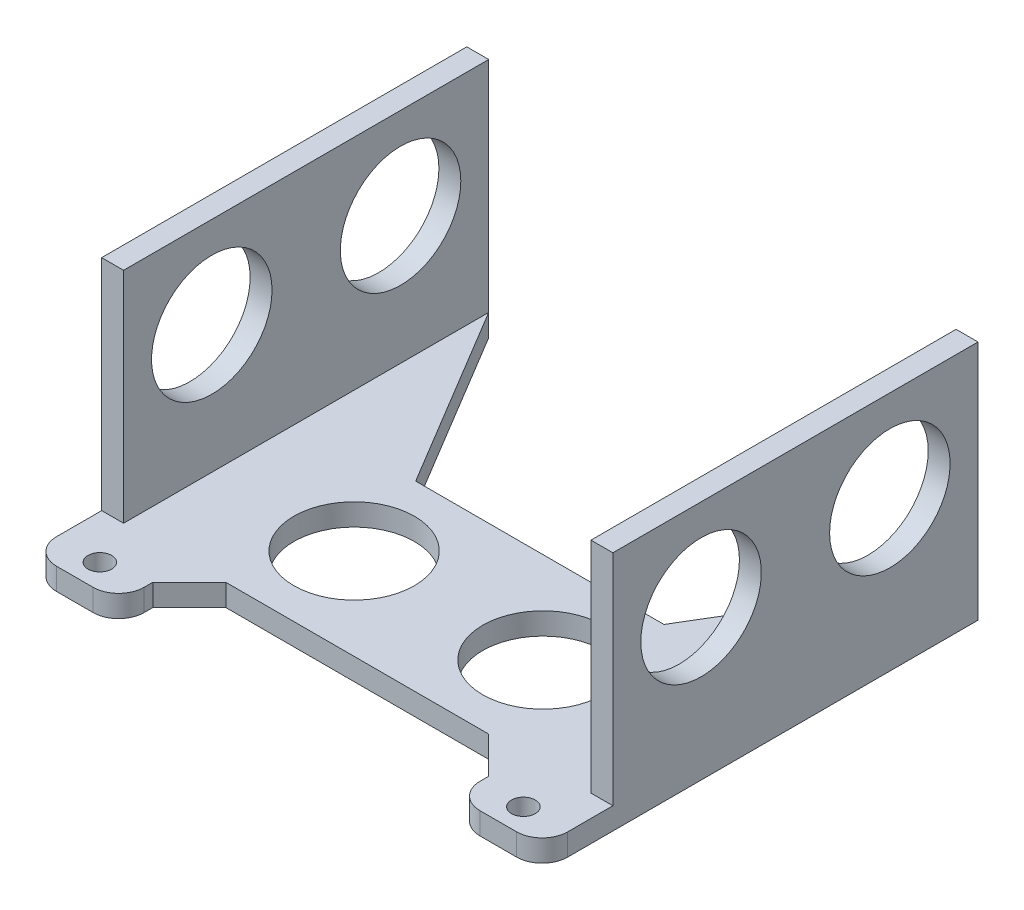
ISO-10303-21;
HEADER;
FILE_DESCRIPTION(('STEP AP214'),'2;1');
FILE_NAME('part.step','',(''),(''),'','','');
FILE_SCHEMA(('AUTOMOTIVE_DESIGN { 1 0 10303 214 1 1 1 1 }'));
ENDSEC;
DATA;
#1=APPLICATION_CONTEXT('core data for automotive mechanical design processes');
#2=APPLICATION_PROTOCOL_DEFINITION('international standard','automotive_design',2000,#1);
#3=PRODUCT_CONTEXT('',#1,'mechanical');
#4=PRODUCT('Part','Part','',(#3));
#5=PRODUCT_RELATED_PRODUCT_CATEGORY('part','',(#4));
#6=PRODUCT_DEFINITION_FORMATION('','',#4);
#7=PRODUCT_DEFINITION_CONTEXT('part definition',#1,'design');
#8=PRODUCT_DEFINITION('design','',#6,#7);
#9=PRODUCT_DEFINITION_SHAPE('','',#8);
#10=(LENGTH_UNIT() NAMED_UNIT(*) SI_UNIT(.MILLI.,.METRE.));
#11=(NAMED_UNIT(*) PLANE_ANGLE_UNIT() SI_UNIT($,.RADIAN.));
#12=(NAMED_UNIT(*) SI_UNIT($,.STERADIAN.) SOLID_ANGLE_UNIT());
#13=UNCERTAINTY_MEASURE_WITH_UNIT(LENGTH_MEASURE(1.E-05),#10,'distance_accuracy_value','');
#14=(GEOMETRIC_REPRESENTATION_CONTEXT(3) GLOBAL_UNCERTAINTY_ASSIGNED_CONTEXT((#13)) GLOBAL_UNIT_ASSIGNED_CONTEXT((#10,
#11,#12)) REPRESENTATION_CONTEXT('',''));
#15=CARTESIAN_POINT('',(0.,0.,0.));
#16=DIRECTION('',(0.,0.,1.));
#17=DIRECTION('',(1.,0.,0.));
#18=AXIS2_PLACEMENT_3D('',#15,#16,#17);
#19=CARTESIAN_POINT('',(0.,3.,0.));
#20=DIRECTION('',(0.,-1.,0.));
#21=DIRECTION('',(0.,0.,-1.));
#22=AXIS2_PLACEMENT_3D('',#19,#20,#21);
#23=PLANE('',#22);
#24=CARTESIAN_POINT('',(29.,3.,25.25));
#25=DIRECTION('',(0.,-1.,0.));
#26=DIRECTION('',(0.,0.,-1.));
#27=AXIS2_PLACEMENT_3D('',#24,#25,#26);
#28=CIRCLE('',#27,1.625);
#29=CARTESIAN_POINT('',(29.,3.,23.625));
#30=VERTEX_POINT('',#29);
#31=EDGE_CURVE('E335',#30,#30,#28,.T.);
#32=ORIENTED_EDGE('',*,*,#31,.T.);
#33=EDGE_LOOP('',(#32));
#34=FACE_BOUND('',#33,.T.);
#35=CARTESIAN_POINT('',(-29.,3.,25.25));
#36=DIRECTION('',(0.,-1.,0.));
#37=DIRECTION('',(0.,0.,-1.));
#38=AXIS2_PLACEMENT_3D('',#35,#36,#37);
#39=CIRCLE('',#38,1.625);
#40=CARTESIAN_POINT('',(-29.,3.,23.625));
#41=VERTEX_POINT('',#40);
#42=EDGE_CURVE('E342',#41,#41,#39,.T.);
#43=ORIENTED_EDGE('',*,*,#42,.T.);
#44=EDGE_LOOP('',(#43));
#45=FACE_BOUND('',#44,.T.);
#46=CARTESIAN_POINT('',(12.93,3.,6.5));
#47=DIRECTION('',(0.,-1.,0.));
#48=DIRECTION('',(0.,0.,-1.));
#49=AXIS2_PLACEMENT_3D('',#46,#47,#48);
#50=CIRCLE('',#49,8.25);
#51=CARTESIAN_POINT('',(12.93,3.,-1.75));
#52=VERTEX_POINT('',#51);
#53=EDGE_CURVE('E319',#52,#52,#50,.T.);
#54=ORIENTED_EDGE('',*,*,#53,.T.);
#55=EDGE_LOOP('',(#54));
#56=FACE_BOUND('',#55,.T.);
#57=CARTESIAN_POINT('',(-12.93,3.,6.5));
#58=DIRECTION('',(0.,-1.,0.));
#59=DIRECTION('',(0.,0.,-1.));
#60=AXIS2_PLACEMENT_3D('',#57,#58,#59);
#61=CIRCLE('',#60,8.25);
#62=CARTESIAN_POINT('',(-12.93,3.,-1.75));
#63=VERTEX_POINT('',#62);
#64=EDGE_CURVE('E326',#63,#63,#61,.T.);
#65=ORIENTED_EDGE('',*,*,#64,.T.);
#66=EDGE_LOOP('',(#65));
#67=FACE_BOUND('',#66,.T.);
#68=DIRECTION('',(1.,0.,0.));
#69=VECTOR('',#68,1.);
#70=CARTESIAN_POINT('',(23.7797680036585,3.,28.6813507597954));
#71=LINE('',#70,#69);
#72=CARTESIAN_POINT('',(26.5,3.,28.6813507597954));
#73=VERTEX_POINT('',#72);
#74=CARTESIAN_POINT('',(31.5,3.,28.6813507597954));
#75=VERTEX_POINT('',#74);
#76=EDGE_CURVE('E551',#73,#75,#71,.T.);
#77=ORIENTED_EDGE('',*,*,#76,.T.);
#78=CARTESIAN_POINT('',(31.5,3.,25.1813507597954));
#79=DIRECTION('',(0.,-1.,0.));
#80=DIRECTION('',(0.,0.,-1.));
#81=AXIS2_PLACEMENT_3D('',#78,#79,#80);
#82=CIRCLE('',#81,3.5);
#83=CARTESIAN_POINT('',(35.,3.,25.1813507597954));
#84=VERTEX_POINT('',#83);
#85=EDGE_CURVE('E478',#75,#84,#82,.F.);
#86=ORIENTED_EDGE('',*,*,#85,.T.);
#87=DIRECTION('',(0.,0.,-1.));
#88=VECTOR('',#87,1.);
#89=CARTESIAN_POINT('',(35.,3.,31.));
#90=LINE('',#89,#88);
#91=CARTESIAN_POINT('',(35.,3.,19.));
#92=VERTEX_POINT('',#91);
#93=EDGE_CURVE('E365',#84,#92,#90,.T.);
#94=ORIENTED_EDGE('',*,*,#93,.T.);
#95=DIRECTION('',(1.,0.,0.));
#96=VECTOR('',#95,1.);
#97=CARTESIAN_POINT('',(32.,3.,19.));
#98=LINE('',#97,#96);
#99=CARTESIAN_POINT('',(32.,3.,19.));
#100=VERTEX_POINT('',#99);
#101=EDGE_CURVE('E259',#100,#92,#98,.T.);
#102=ORIENTED_EDGE('',*,*,#101,.F.);
#103=DIRECTION('',(0.,0.,-1.));
#104=VECTOR('',#103,1.);
#105=CARTESIAN_POINT('',(32.,3.,-31.));
#106=LINE('',#105,#104);
#107=CARTESIAN_POINT('',(32.,3.,-31.));
#108=VERTEX_POINT('',#107);
#109=EDGE_CURVE('E225',#100,#108,#106,.T.);
#110=ORIENTED_EDGE('',*,*,#109,.T.);
#111=DIRECTION('',(0.514495755427526,0.,-0.857492925712544));
#112=VECTOR('',#111,1.);
#113=CARTESIAN_POINT('',(9.85294117647059,3.,5.91176470588235));
#114=LINE('',#113,#112);
#115=CARTESIAN_POINT('',(17.,3.,-6.00000000000001));
#116=VERTEX_POINT('',#115);
#117=EDGE_CURVE('E436',#116,#108,#114,.T.);
#118=ORIENTED_EDGE('',*,*,#117,.F.);
#119=DIRECTION('',(1.,0.,0.));
#120=VECTOR('',#119,1.);
#121=CARTESIAN_POINT('',(0.,3.,-6.00000000000001));
#122=LINE('',#121,#120);
#123=CARTESIAN_POINT('',(-17.,3.,-6.));
#124=VERTEX_POINT('',#123);
#125=EDGE_CURVE('E294',#124,#116,#122,.T.);
#126=ORIENTED_EDGE('',*,*,#125,.F.);
#127=DIRECTION('',(0.514495755427526,0.,0.857492925712544));
#128=VECTOR('',#127,1.);
#129=CARTESIAN_POINT('',(-9.85294117647059,3.,5.91176470588235));
#130=LINE('',#129,#128);
#131=CARTESIAN_POINT('',(-32.,3.,-31.));
#132=VERTEX_POINT('',#131);
#133=EDGE_CURVE('E423',#132,#124,#130,.T.);
#134=ORIENTED_EDGE('',*,*,#133,.F.);
#135=DIRECTION('',(0.,0.,1.));
#136=VECTOR('',#135,1.);
#137=CARTESIAN_POINT('',(-32.,3.,-31.));
#138=LINE('',#137,#136);
#139=CARTESIAN_POINT('',(-32.,3.,19.));
#140=VERTEX_POINT('',#139);
#141=EDGE_CURVE('E270',#132,#140,#138,.T.);
#142=ORIENTED_EDGE('',*,*,#141,.T.);
#143=DIRECTION('',(-1.,0.,0.));
#144=VECTOR('',#143,1.);
#145=CARTESIAN_POINT('',(-32.,3.,19.));
#146=LINE('',#145,#144);
#147=CARTESIAN_POINT('',(-35.,3.,19.));
#148=VERTEX_POINT('',#147);
#149=EDGE_CURVE('E283',#140,#148,#146,.T.);
#150=ORIENTED_EDGE('',*,*,#149,.T.);
#151=DIRECTION('',(0.,0.,1.));
#152=VECTOR('',#151,1.);
#153=CARTESIAN_POINT('',(-35.,3.,31.));
#154=LINE('',#153,#152);
#155=CARTESIAN_POINT('',(-35.,3.,25.1813507597954));
#156=VERTEX_POINT('',#155);
#157=EDGE_CURVE('E368',#148,#156,#154,.T.);
#158=ORIENTED_EDGE('',*,*,#157,.T.);
#159=CARTESIAN_POINT('',(-31.5,3.,25.1813507597954));
#160=DIRECTION('',(0.,-1.,0.));
#161=DIRECTION('',(0.,0.,-1.));
#162=AXIS2_PLACEMENT_3D('',#159,#160,#161);
#163=CIRCLE('',#162,3.5);
#164=CARTESIAN_POINT('',(-31.5,3.,28.6813507597954));
#165=VERTEX_POINT('',#164);
#166=EDGE_CURVE('E455',#156,#165,#163,.F.);
#167=ORIENTED_EDGE('',*,*,#166,.T.);
#168=DIRECTION('',(1.,0.,0.));
#169=VECTOR('',#168,1.);
#170=CARTESIAN_POINT('',(-34.2202319963415,3.,28.6813507597954));
#171=LINE('',#170,#169);
#172=CARTESIAN_POINT('',(-26.5,3.,28.6813507597954));
#173=VERTEX_POINT('',#172);
#174=EDGE_CURVE('E557',#165,#173,#171,.T.);
#175=ORIENTED_EDGE('',*,*,#174,.T.);
#176=CARTESIAN_POINT('',(-26.5,3.,25.1813507597954));
#177=DIRECTION('',(0.,-1.,0.));
#178=DIRECTION('',(0.,0.,-1.));
#179=AXIS2_PLACEMENT_3D('',#176,#177,#178);
#180=CIRCLE('',#179,3.5);
#181=CARTESIAN_POINT('',(-23.,3.,25.1813507597954));
#182=VERTEX_POINT('',#181);
#183=EDGE_CURVE('E475',#173,#182,#180,.F.);
#184=ORIENTED_EDGE('',*,*,#183,.T.);
#185=DIRECTION('',(0.,0.,1.));
#186=VECTOR('',#185,1.);
#187=CARTESIAN_POINT('',(-23.,3.,31.));
#188=LINE('',#187,#186);
#189=CARTESIAN_POINT('',(-23.,3.,24.));
#190=VERTEX_POINT('',#189);
#191=EDGE_CURVE('E357',#190,#182,#188,.T.);
#192=ORIENTED_EDGE('',*,*,#191,.F.);
#193=DIRECTION('',(-0.707106781186547,0.,0.707106781186548));
#194=VECTOR('',#193,1.);
#195=CARTESIAN_POINT('',(0.499999999999986,3.,0.499999999999986));
#196=LINE('',#195,#194);
#197=CARTESIAN_POINT('',(-18.,3.,19.));
#198=VERTEX_POINT('',#197);
#199=EDGE_CURVE('E397',#198,#190,#196,.T.);
#200=ORIENTED_EDGE('',*,*,#199,.F.);
#201=DIRECTION('',(-1.,0.,0.));
#202=VECTOR('',#201,1.);
#203=CARTESIAN_POINT('',(0.,3.,19.));
#204=LINE('',#203,#202);
#205=CARTESIAN_POINT('',(18.,3.,19.));
#206=VERTEX_POINT('',#205);
#207=EDGE_CURVE('E346',#206,#198,#204,.T.);
#208=ORIENTED_EDGE('',*,*,#207,.F.);
#209=DIRECTION('',(-0.707106781186548,0.,-0.707106781186547));
#210=VECTOR('',#209,1.);
#211=CARTESIAN_POINT('',(-0.500000000000008,3.,0.500000000000008));
#212=LINE('',#211,#210);
#213=CARTESIAN_POINT('',(23.,3.,24.));
#214=VERTEX_POINT('',#213);
#215=EDGE_CURVE('E412',#214,#206,#212,.T.);
#216=ORIENTED_EDGE('',*,*,#215,.F.);
#217=DIRECTION('',(0.,0.,-1.));
#218=VECTOR('',#217,1.);
#219=CARTESIAN_POINT('',(23.,3.,21.));
#220=LINE('',#219,#218);
#221=CARTESIAN_POINT('',(23.,3.,25.1813507597954));
#222=VERTEX_POINT('',#221);
#223=EDGE_CURVE('E350',#222,#214,#220,.T.);
#224=ORIENTED_EDGE('',*,*,#223,.F.);
#225=CARTESIAN_POINT('',(26.5,3.,25.1813507597954));
#226=DIRECTION('',(0.,-1.,0.));
#227=DIRECTION('',(0.,0.,-1.));
#228=AXIS2_PLACEMENT_3D('',#225,#226,#227);
#229=CIRCLE('',#228,3.5);
#230=EDGE_CURVE('E472',#222,#73,#229,.F.);
#231=ORIENTED_EDGE('',*,*,#230,.T.);
#232=EDGE_LOOP('',(#77,#86,#94,#102,#110,#118,#126,#134,#142,#150,#158,#167,#175,#184,#192,#200,
#208,#216,#224,#231));
#233=FACE_BOUND('',#232,.T.);
#234=ADVANCED_FACE('F55',(#34,#45,#56,#67,#233),#23,.F.);
#235=CARTESIAN_POINT('',(0.,0.,0.));
#236=DIRECTION('',(0.,-1.,0.));
#237=DIRECTION('',(0.,0.,-1.));
#238=AXIS2_PLACEMENT_3D('',#235,#236,#237);
#239=PLANE('',#238);
#240=DIRECTION('',(0.,0.,-1.));
#241=VECTOR('',#240,1.);
#242=CARTESIAN_POINT('',(35.,0.,31.));
#243=LINE('',#242,#241);
#244=CARTESIAN_POINT('',(35.,0.,25.1813507597954));
#245=VERTEX_POINT('',#244);
#246=CARTESIAN_POINT('',(35.,0.,-31.));
#247=VERTEX_POINT('',#246);
#248=EDGE_CURVE('E360',#245,#247,#243,.T.);
#249=ORIENTED_EDGE('',*,*,#248,.F.);
#250=CARTESIAN_POINT('',(31.5,0.,25.1813507597954));
#251=DIRECTION('',(0.,-1.,0.));
#252=DIRECTION('',(0.,0.,-1.));
#253=AXIS2_PLACEMENT_3D('',#250,#251,#252);
#254=CIRCLE('',#253,3.5);
#255=CARTESIAN_POINT('',(31.5,0.,28.6813507597954));
#256=VERTEX_POINT('',#255);
#257=EDGE_CURVE('E489',#245,#256,#254,.T.);
#258=ORIENTED_EDGE('',*,*,#257,.T.);
#259=DIRECTION('',(-1.,0.,0.));
#260=VECTOR('',#259,1.);
#261=CARTESIAN_POINT('',(0.,0.,28.6813507597954));
#262=LINE('',#261,#260);
#263=CARTESIAN_POINT('',(26.5,0.,28.6813507597954));
#264=VERTEX_POINT('',#263);
#265=EDGE_CURVE('E553',#256,#264,#262,.T.);
#266=ORIENTED_EDGE('',*,*,#265,.T.);
#267=CARTESIAN_POINT('',(26.5,0.,25.1813507597954));
#268=DIRECTION('',(0.,-1.,0.));
#269=DIRECTION('',(0.,0.,-1.));
#270=AXIS2_PLACEMENT_3D('',#267,#268,#269);
#271=CIRCLE('',#270,3.5);
#272=CARTESIAN_POINT('',(23.,0.,25.1813507597954));
#273=VERTEX_POINT('',#272);
#274=EDGE_CURVE('E78',#264,#273,#271,.T.);
#275=ORIENTED_EDGE('',*,*,#274,.T.);
#276=DIRECTION('',(0.,0.,-1.));
#277=VECTOR('',#276,1.);
#278=CARTESIAN_POINT('',(23.,0.,21.));
#279=LINE('',#278,#277);
#280=CARTESIAN_POINT('',(23.,0.,24.));
#281=VERTEX_POINT('',#280);
#282=EDGE_CURVE('E353',#273,#281,#279,.T.);
#283=ORIENTED_EDGE('',*,*,#282,.T.);
#284=DIRECTION('',(0.707106781186548,0.,0.707106781186547));
#285=VECTOR('',#284,1.);
#286=CARTESIAN_POINT('',(23.,0.,24.));
#287=LINE('',#286,#285);
#288=CARTESIAN_POINT('',(18.,0.,19.));
#289=VERTEX_POINT('',#288);
#290=EDGE_CURVE('E415',#289,#281,#287,.T.);
#291=ORIENTED_EDGE('',*,*,#290,.F.);
#292=DIRECTION('',(-1.,0.,0.));
#293=VECTOR('',#292,1.);
#294=CARTESIAN_POINT('',(0.,0.,19.));
#295=LINE('',#294,#293);
#296=CARTESIAN_POINT('',(-18.,0.,19.));
#297=VERTEX_POINT('',#296);
#298=EDGE_CURVE('E347',#289,#297,#295,.T.);
#299=ORIENTED_EDGE('',*,*,#298,.T.);
#300=DIRECTION('',(0.707106781186547,0.,-0.707106781186548));
#301=VECTOR('',#300,1.);
#302=CARTESIAN_POINT('',(-18.,0.,19.));
#303=LINE('',#302,#301);
#304=CARTESIAN_POINT('',(-23.,0.,24.));
#305=VERTEX_POINT('',#304);
#306=EDGE_CURVE('E400',#305,#297,#303,.T.);
#307=ORIENTED_EDGE('',*,*,#306,.F.);
#308=DIRECTION('',(0.,0.,1.));
#309=VECTOR('',#308,1.);
#310=CARTESIAN_POINT('',(-23.,0.,31.));
#311=LINE('',#310,#309);
#312=CARTESIAN_POINT('',(-23.,0.,25.1813507597954));
#313=VERTEX_POINT('',#312);
#314=EDGE_CURVE('E356',#305,#313,#311,.T.);
#315=ORIENTED_EDGE('',*,*,#314,.T.);
#316=CARTESIAN_POINT('',(-26.5,0.,25.1813507597954));
#317=DIRECTION('',(0.,-1.,0.));
#318=DIRECTION('',(0.,0.,-1.));
#319=AXIS2_PLACEMENT_3D('',#316,#317,#318);
#320=CIRCLE('',#319,3.5);
#321=CARTESIAN_POINT('',(-26.5,0.,28.6813507597954));
#322=VERTEX_POINT('',#321);
#323=EDGE_CURVE('E486',#313,#322,#320,.T.);
#324=ORIENTED_EDGE('',*,*,#323,.T.);
#325=DIRECTION('',(-1.,0.,0.));
#326=VECTOR('',#325,1.);
#327=CARTESIAN_POINT('',(0.,0.,28.6813507597954));
#328=LINE('',#327,#326);
#329=CARTESIAN_POINT('',(-31.5,0.,28.6813507597954));
#330=VERTEX_POINT('',#329);
#331=EDGE_CURVE('E511',#322,#330,#328,.T.);
#332=ORIENTED_EDGE('',*,*,#331,.T.);
#333=CARTESIAN_POINT('',(-31.5,0.,25.1813507597954));
#334=DIRECTION('',(0.,-1.,0.));
#335=DIRECTION('',(0.,0.,-1.));
#336=AXIS2_PLACEMENT_3D('',#333,#334,#335);
#337=CIRCLE('',#336,3.5);
#338=CARTESIAN_POINT('',(-35.,0.,25.1813507597954));
#339=VERTEX_POINT('',#338);
#340=EDGE_CURVE('E462',#330,#339,#337,.T.);
#341=ORIENTED_EDGE('',*,*,#340,.T.);
#342=DIRECTION('',(0.,0.,1.));
#343=VECTOR('',#342,1.);
#344=CARTESIAN_POINT('',(-35.,0.,31.));
#345=LINE('',#344,#343);
#346=CARTESIAN_POINT('',(-35.,0.,-31.));
#347=VERTEX_POINT('',#346);
#348=EDGE_CURVE('E369',#347,#339,#345,.T.);
#349=ORIENTED_EDGE('',*,*,#348,.F.);
#350=DIRECTION('',(-1.,0.,0.));
#351=VECTOR('',#350,1.);
#352=CARTESIAN_POINT('',(-35.,0.,-31.));
#353=LINE('',#352,#351);
#354=CARTESIAN_POINT('',(-32.,0.,-31.));
#355=VERTEX_POINT('',#354);
#356=EDGE_CURVE('E376',#355,#347,#353,.T.);
#357=ORIENTED_EDGE('',*,*,#356,.F.);
#358=DIRECTION('',(-0.514495755427526,0.,-0.857492925712544));
#359=VECTOR('',#358,1.);
#360=CARTESIAN_POINT('',(-32.,0.,-31.));
#361=LINE('',#360,#359);
#362=CARTESIAN_POINT('',(-17.,0.,-6.00000000000001));
#363=VERTEX_POINT('',#362);
#364=EDGE_CURVE('E426',#363,#355,#361,.T.);
#365=ORIENTED_EDGE('',*,*,#364,.F.);
#366=DIRECTION('',(1.,0.,0.));
#367=VECTOR('',#366,1.);
#368=CARTESIAN_POINT('',(32.,0.,-6.00000000000001));
#369=LINE('',#368,#367);
#370=CARTESIAN_POINT('',(17.,0.,-6.00000000000001));
#371=VERTEX_POINT('',#370);
#372=EDGE_CURVE('E301',#363,#371,#369,.T.);
#373=ORIENTED_EDGE('',*,*,#372,.T.);
#374=DIRECTION('',(-0.514495755427526,0.,0.857492925712544));
#375=VECTOR('',#374,1.);
#376=CARTESIAN_POINT('',(32.,0.,-31.));
#377=LINE('',#376,#375);
#378=CARTESIAN_POINT('',(32.,0.,-31.));
#379=VERTEX_POINT('',#378);
#380=EDGE_CURVE('E433',#379,#371,#377,.T.);
#381=ORIENTED_EDGE('',*,*,#380,.F.);
#382=EDGE_CURVE('E377',#247,#379,#353,.T.);
#383=ORIENTED_EDGE('',*,*,#382,.F.);
#384=EDGE_LOOP('',(#249,#258,#266,#275,#283,#291,#299,#307,#315,#324,#332,#341,#349,#357,#365,
#373,#381,#383));
#385=FACE_BOUND('',#384,.T.);
#386=CARTESIAN_POINT('',(-12.93,0.,6.5));
#387=DIRECTION('',(0.,1.,0.));
#388=DIRECTION('',(0.,0.,1.));
#389=AXIS2_PLACEMENT_3D('',#386,#387,#388);
#390=CIRCLE('',#389,8.25);
#391=CARTESIAN_POINT('',(-12.93,0.,14.75));
#392=VERTEX_POINT('',#391);
#393=EDGE_CURVE('E315',#392,#392,#390,.T.);
#394=ORIENTED_EDGE('',*,*,#393,.T.);
#395=EDGE_LOOP('',(#394));
#396=FACE_BOUND('',#395,.T.);
#397=CARTESIAN_POINT('',(12.93,0.,6.5));
#398=DIRECTION('',(0.,1.,0.));
#399=DIRECTION('',(0.,0.,1.));
#400=AXIS2_PLACEMENT_3D('',#397,#398,#399);
#401=CIRCLE('',#400,8.25);
#402=CARTESIAN_POINT('',(12.93,0.,14.75));
#403=VERTEX_POINT('',#402);
#404=EDGE_CURVE('E312',#403,#403,#401,.T.);
#405=ORIENTED_EDGE('',*,*,#404,.T.);
#406=EDGE_LOOP('',(#405));
#407=FACE_BOUND('',#406,.T.);
#408=CARTESIAN_POINT('',(-29.,0.,25.25));
#409=DIRECTION('',(0.,1.,0.));
#410=DIRECTION('',(0.,0.,1.));
#411=AXIS2_PLACEMENT_3D('',#408,#409,#410);
#412=CIRCLE('',#411,1.625);
#413=CARTESIAN_POINT('',(-29.,0.,26.875));
#414=VERTEX_POINT('',#413);
#415=EDGE_CURVE('E331',#414,#414,#412,.T.);
#416=ORIENTED_EDGE('',*,*,#415,.T.);
#417=EDGE_LOOP('',(#416));
#418=FACE_BOUND('',#417,.T.);
#419=CARTESIAN_POINT('',(29.,0.,25.25));
#420=DIRECTION('',(0.,1.,0.));
#421=DIRECTION('',(0.,0.,1.));
#422=AXIS2_PLACEMENT_3D('',#419,#420,#421);
#423=CIRCLE('',#422,1.625);
#424=CARTESIAN_POINT('',(29.,0.,26.875));
#425=VERTEX_POINT('',#424);
#426=EDGE_CURVE('E330',#425,#425,#423,.T.);
#427=ORIENTED_EDGE('',*,*,#426,.T.);
#428=EDGE_LOOP('',(#427));
#429=FACE_BOUND('',#428,.T.);
#430=ADVANCED_FACE('F507',(#385,#396,#407,#418,#429),#239,.T.);
#431=CARTESIAN_POINT('',(32.,0.,-31.));
#432=DIRECTION('',(-0.857492925712544,0.,-0.514495755427526));
#433=DIRECTION('',(0.,-1.,0.));
#434=AXIS2_PLACEMENT_3D('',#431,#432,#433);
#435=PLANE('',#434);
#436=DIRECTION('',(0.,-1.,0.));
#437=VECTOR('',#436,1.);
#438=CARTESIAN_POINT('',(17.,0.,-6.00000000000001));
#439=LINE('',#438,#437);
#440=EDGE_CURVE('E429',#116,#371,#439,.T.);
#441=ORIENTED_EDGE('',*,*,#440,.F.);
#442=ORIENTED_EDGE('',*,*,#117,.T.);
#443=DIRECTION('',(0.,1.,0.));
#444=VECTOR('',#443,1.);
#445=CARTESIAN_POINT('',(32.,0.,-31.));
#446=LINE('',#445,#444);
#447=EDGE_CURVE('E240',#379,#108,#446,.T.);
#448=ORIENTED_EDGE('',*,*,#447,.F.);
#449=ORIENTED_EDGE('',*,*,#380,.T.);
#450=EDGE_LOOP('',(#441,#442,#448,#449));
#451=FACE_BOUND('',#450,.T.);
#452=ADVANCED_FACE('F540',(#451),#435,.T.);
#453=CARTESIAN_POINT('',(-32.,0.,-31.));
#454=DIRECTION('',(0.857492925712544,0.,-0.514495755427526));
#455=DIRECTION('',(0.,1.,0.));
#456=AXIS2_PLACEMENT_3D('',#453,#454,#455);
#457=PLANE('',#456);
#458=DIRECTION('',(0.,1.,0.));
#459=VECTOR('',#458,1.);
#460=CARTESIAN_POINT('',(-32.,0.,-31.));
#461=LINE('',#460,#459);
#462=EDGE_CURVE('E308',#355,#132,#461,.T.);
#463=ORIENTED_EDGE('',*,*,#462,.T.);
#464=ORIENTED_EDGE('',*,*,#133,.T.);
#465=DIRECTION('',(0.,1.,0.));
#466=VECTOR('',#465,1.);
#467=CARTESIAN_POINT('',(-17.,3.,-6.));
#468=LINE('',#467,#466);
#469=EDGE_CURVE('E419',#363,#124,#468,.T.);
#470=ORIENTED_EDGE('',*,*,#469,.F.);
#471=ORIENTED_EDGE('',*,*,#364,.T.);
#472=EDGE_LOOP('',(#463,#464,#470,#471));
#473=FACE_BOUND('',#472,.T.);
#474=ADVANCED_FACE('F533',(#473),#457,.T.);
#475=CARTESIAN_POINT('',(-35.,3.,-31.));
#476=DIRECTION('',(0.,0.,1.));
#477=DIRECTION('',(1.,0.,0.));
#478=AXIS2_PLACEMENT_3D('',#475,#476,#477);
#479=PLANE('',#478);
#480=DIRECTION('',(0.,-1.,0.));
#481=VECTOR('',#480,1.);
#482=CARTESIAN_POINT('',(-35.,3.,-31.));
#483=LINE('',#482,#481);
#484=CARTESIAN_POINT('',(-35.,33.,-31.));
#485=VERTEX_POINT('',#484);
#486=EDGE_CURVE('E373',#485,#347,#483,.T.);
#487=ORIENTED_EDGE('',*,*,#486,.F.);
#488=DIRECTION('',(-1.,0.,0.));
#489=VECTOR('',#488,1.);
#490=CARTESIAN_POINT('',(-32.,33.,-31.));
#491=LINE('',#490,#489);
#492=CARTESIAN_POINT('',(-32.,33.,-31.));
#493=VERTEX_POINT('',#492);
#494=EDGE_CURVE('E290',#493,#485,#491,.T.);
#495=ORIENTED_EDGE('',*,*,#494,.F.);
#496=DIRECTION('',(0.,-1.,0.));
#497=VECTOR('',#496,1.);
#498=CARTESIAN_POINT('',(-32.,3.,-31.));
#499=LINE('',#498,#497);
#500=EDGE_CURVE('E266',#493,#132,#499,.T.);
#501=ORIENTED_EDGE('',*,*,#500,.T.);
#502=ORIENTED_EDGE('',*,*,#462,.F.);
#503=ORIENTED_EDGE('',*,*,#356,.T.);
#504=EDGE_LOOP('',(#487,#495,#501,#502,#503));
#505=FACE_BOUND('',#504,.T.);
#506=ADVANCED_FACE('F500',(#505),#479,.F.);
#507=CARTESIAN_POINT('',(23.,0.,24.));
#508=DIRECTION('',(-0.707106781186547,0.,0.707106781186548));
#509=DIRECTION('',(0.,1.,0.));
#510=AXIS2_PLACEMENT_3D('',#507,#508,#509);
#511=PLANE('',#510);
#512=DIRECTION('',(0.,-1.,0.));
#513=VECTOR('',#512,1.);
#514=CARTESIAN_POINT('',(23.,3.,24.));
#515=LINE('',#514,#513);
#516=EDGE_CURVE('E404',#214,#281,#515,.T.);
#517=ORIENTED_EDGE('',*,*,#516,.F.);
#518=ORIENTED_EDGE('',*,*,#215,.T.);
#519=DIRECTION('',(0.,1.,0.));
#520=VECTOR('',#519,1.);
#521=CARTESIAN_POINT('',(18.,3.,19.));
#522=LINE('',#521,#520);
#523=EDGE_CURVE('E408',#289,#206,#522,.T.);
#524=ORIENTED_EDGE('',*,*,#523,.F.);
#525=ORIENTED_EDGE('',*,*,#290,.T.);
#526=EDGE_LOOP('',(#517,#518,#524,#525));
#527=FACE_BOUND('',#526,.T.);
#528=ADVANCED_FACE('F632',(#527),#511,.T.);
#529=CARTESIAN_POINT('',(-18.,0.,19.));
#530=DIRECTION('',(0.707106781186548,0.,0.707106781186547));
#531=DIRECTION('',(0.,1.,0.));
#532=AXIS2_PLACEMENT_3D('',#529,#530,#531);
#533=PLANE('',#532);
#534=DIRECTION('',(0.,-1.,0.));
#535=VECTOR('',#534,1.);
#536=CARTESIAN_POINT('',(-18.,3.,19.));
#537=LINE('',#536,#535);
#538=EDGE_CURVE('E389',#198,#297,#537,.T.);
#539=ORIENTED_EDGE('',*,*,#538,.F.);
#540=ORIENTED_EDGE('',*,*,#199,.T.);
#541=DIRECTION('',(0.,1.,0.));
#542=VECTOR('',#541,1.);
#543=CARTESIAN_POINT('',(-23.,3.,24.));
#544=LINE('',#543,#542);
#545=EDGE_CURVE('E393',#305,#190,#544,.T.);
#546=ORIENTED_EDGE('',*,*,#545,.F.);
#547=ORIENTED_EDGE('',*,*,#306,.T.);
#548=EDGE_LOOP('',(#539,#540,#546,#547));
#549=FACE_BOUND('',#548,.T.);
#550=ADVANCED_FACE('F624',(#549),#533,.T.);
#551=CARTESIAN_POINT('',(35.,3.,31.));
#552=DIRECTION('',(-1.,0.,0.));
#553=DIRECTION('',(0.,0.,1.));
#554=AXIS2_PLACEMENT_3D('',#551,#552,#553);
#555=PLANE('',#554);
#556=CARTESIAN_POINT('',(35.,20.5,-18.93));
#557=DIRECTION('',(-1.,0.,0.));
#558=DIRECTION('',(0.,0.,1.));
#559=AXIS2_PLACEMENT_3D('',#556,#557,#558);
#560=CIRCLE('',#559,8.25);
#561=CARTESIAN_POINT('',(35.,20.5,-10.68));
#562=VERTEX_POINT('',#561);
#563=EDGE_CURVE('E445',#562,#562,#560,.T.);
#564=ORIENTED_EDGE('',*,*,#563,.T.);
#565=EDGE_LOOP('',(#564));
#566=FACE_BOUND('',#565,.T.);
#567=CARTESIAN_POINT('',(35.,20.5,6.92));
#568=DIRECTION('',(-1.,0.,0.));
#569=DIRECTION('',(0.,0.,1.));
#570=AXIS2_PLACEMENT_3D('',#567,#568,#569);
#571=CIRCLE('',#570,8.25);
#572=CARTESIAN_POINT('',(35.,20.5,15.17));
#573=VERTEX_POINT('',#572);
#574=EDGE_CURVE('E566',#573,#573,#571,.T.);
#575=ORIENTED_EDGE('',*,*,#574,.T.);
#576=EDGE_LOOP('',(#575));
#577=FACE_BOUND('',#576,.T.);
#578=ORIENTED_EDGE('',*,*,#93,.F.);
#579=DIRECTION('',(0.,1.,0.));
#580=VECTOR('',#579,1.);
#581=CARTESIAN_POINT('',(35.,0.,25.1813507597954));
#582=LINE('',#581,#580);
#583=EDGE_CURVE('E481',#84,#245,#582,.F.);
#584=ORIENTED_EDGE('',*,*,#583,.T.);
#585=ORIENTED_EDGE('',*,*,#248,.T.);
#586=DIRECTION('',(0.,-1.,0.));
#587=VECTOR('',#586,1.);
#588=CARTESIAN_POINT('',(35.,3.,-31.));
#589=LINE('',#588,#587);
#590=CARTESIAN_POINT('',(35.,33.,-31.));
#591=VERTEX_POINT('',#590);
#592=EDGE_CURVE('E386',#591,#247,#589,.T.);
#593=ORIENTED_EDGE('',*,*,#592,.F.);
#594=DIRECTION('',(0.,0.,1.));
#595=VECTOR('',#594,1.);
#596=CARTESIAN_POINT('',(35.,33.,-31.));
#597=LINE('',#596,#595);
#598=CARTESIAN_POINT('',(35.,33.,19.));
#599=VERTEX_POINT('',#598);
#600=EDGE_CURVE('E219',#591,#599,#597,.T.);
#601=ORIENTED_EDGE('',*,*,#600,.T.);
#602=DIRECTION('',(0.,-1.,0.));
#603=VECTOR('',#602,1.);
#604=CARTESIAN_POINT('',(35.,3.,19.));
#605=LINE('',#604,#603);
#606=EDGE_CURVE('E243',#599,#92,#605,.T.);
#607=ORIENTED_EDGE('',*,*,#606,.T.);
#608=EDGE_LOOP('',(#578,#584,#585,#593,#601,#607));
#609=FACE_BOUND('',#608,.T.);
#610=ADVANCED_FACE('F621',(#566,#577,#609),#555,.F.);
#611=ORIENTED_EDGE('',*,*,#382,.T.);
#612=ORIENTED_EDGE('',*,*,#447,.T.);
#613=DIRECTION('',(0.,1.,0.));
#614=VECTOR('',#613,1.);
#615=CARTESIAN_POINT('',(32.,3.,-31.));
#616=LINE('',#615,#614);
#617=CARTESIAN_POINT('',(32.,33.,-31.));
#618=VERTEX_POINT('',#617);
#619=EDGE_CURVE('E232',#108,#618,#616,.T.);
#620=ORIENTED_EDGE('',*,*,#619,.T.);
#621=DIRECTION('',(1.,0.,0.));
#622=VECTOR('',#621,1.);
#623=CARTESIAN_POINT('',(32.,33.,-31.));
#624=LINE('',#623,#622);
#625=EDGE_CURVE('E214',#618,#591,#624,.T.);
#626=ORIENTED_EDGE('',*,*,#625,.T.);
#627=ORIENTED_EDGE('',*,*,#592,.T.);
#628=EDGE_LOOP('',(#611,#612,#620,#626,#627));
#629=FACE_BOUND('',#628,.T.);
#630=ADVANCED_FACE('F238',(#629),#479,.F.);
#631=CARTESIAN_POINT('',(-35.,3.,31.));
#632=DIRECTION('',(1.,0.,0.));
#633=DIRECTION('',(0.,0.,-1.));
#634=AXIS2_PLACEMENT_3D('',#631,#632,#633);
#635=PLANE('',#634);
#636=CARTESIAN_POINT('',(-35.,20.5,-18.93));
#637=DIRECTION('',(1.,0.,0.));
#638=DIRECTION('',(0.,0.,-1.));
#639=AXIS2_PLACEMENT_3D('',#636,#637,#638);
#640=CIRCLE('',#639,8.25);
#641=CARTESIAN_POINT('',(-35.,20.5,-27.18));
#642=VERTEX_POINT('',#641);
#643=EDGE_CURVE('E249',#642,#642,#640,.T.);
#644=ORIENTED_EDGE('',*,*,#643,.T.);
#645=EDGE_LOOP('',(#644));
#646=FACE_BOUND('',#645,.T.);
#647=CARTESIAN_POINT('',(-35.,20.5,6.92));
#648=DIRECTION('',(1.,0.,0.));
#649=DIRECTION('',(0.,0.,-1.));
#650=AXIS2_PLACEMENT_3D('',#647,#648,#649);
#651=CIRCLE('',#650,8.25);
#652=CARTESIAN_POINT('',(-35.,20.5,-1.33));
#653=VERTEX_POINT('',#652);
#654=EDGE_CURVE('E451',#653,#653,#651,.T.);
#655=ORIENTED_EDGE('',*,*,#654,.T.);
#656=EDGE_LOOP('',(#655));
#657=FACE_BOUND('',#656,.T.);
#658=ORIENTED_EDGE('',*,*,#348,.T.);
#659=DIRECTION('',(0.,1.,0.));
#660=VECTOR('',#659,1.);
#661=CARTESIAN_POINT('',(-35.,3.,25.1813507597954));
#662=LINE('',#661,#660);
#663=EDGE_CURVE('E439',#339,#156,#662,.T.);
#664=ORIENTED_EDGE('',*,*,#663,.T.);
#665=ORIENTED_EDGE('',*,*,#157,.F.);
#666=DIRECTION('',(0.,1.,0.));
#667=VECTOR('',#666,1.);
#668=CARTESIAN_POINT('',(-35.,3.,19.));
#669=LINE('',#668,#667);
#670=CARTESIAN_POINT('',(-35.,33.,19.));
#671=VERTEX_POINT('',#670);
#672=EDGE_CURVE('E263',#148,#671,#669,.T.);
#673=ORIENTED_EDGE('',*,*,#672,.T.);
#674=DIRECTION('',(0.,0.,-1.));
#675=VECTOR('',#674,1.);
#676=CARTESIAN_POINT('',(-35.,33.,-31.));
#677=LINE('',#676,#675);
#678=EDGE_CURVE('E271',#671,#485,#677,.T.);
#679=ORIENTED_EDGE('',*,*,#678,.T.);
#680=ORIENTED_EDGE('',*,*,#486,.T.);
#681=EDGE_LOOP('',(#658,#664,#665,#673,#679,#680));
#682=FACE_BOUND('',#681,.T.);
#683=ADVANCED_FACE('F503',(#646,#657,#682),#635,.F.);
#684=CARTESIAN_POINT('',(23.,0.,21.));
#685=DIRECTION('',(1.,0.,0.));
#686=DIRECTION('',(0.,0.,-1.));
#687=AXIS2_PLACEMENT_3D('',#684,#685,#686);
#688=PLANE('',#687);
#689=ORIENTED_EDGE('',*,*,#282,.F.);
#690=DIRECTION('',(0.,1.,0.));
#691=VECTOR('',#690,1.);
#692=CARTESIAN_POINT('',(23.,3.,25.1813507597954));
#693=LINE('',#692,#691);
#694=EDGE_CURVE('E13',#273,#222,#693,.T.);
#695=ORIENTED_EDGE('',*,*,#694,.T.);
#696=ORIENTED_EDGE('',*,*,#223,.T.);
#697=ORIENTED_EDGE('',*,*,#516,.T.);
#698=EDGE_LOOP('',(#689,#695,#696,#697));
#699=FACE_BOUND('',#698,.T.);
#700=ADVANCED_FACE('F614',(#699),#688,.F.);
#701=CARTESIAN_POINT('',(-23.,0.,31.));
#702=DIRECTION('',(-1.,0.,0.));
#703=DIRECTION('',(0.,0.,1.));
#704=AXIS2_PLACEMENT_3D('',#701,#702,#703);
#705=PLANE('',#704);
#706=ORIENTED_EDGE('',*,*,#191,.T.);
#707=DIRECTION('',(0.,1.,0.));
#708=VECTOR('',#707,1.);
#709=CARTESIAN_POINT('',(-23.,0.,25.1813507597954));
#710=LINE('',#709,#708);
#711=EDGE_CURVE('E64',#182,#313,#710,.F.);
#712=ORIENTED_EDGE('',*,*,#711,.T.);
#713=ORIENTED_EDGE('',*,*,#314,.F.);
#714=ORIENTED_EDGE('',*,*,#545,.T.);
#715=EDGE_LOOP('',(#706,#712,#713,#714));
#716=FACE_BOUND('',#715,.T.);
#717=ADVANCED_FACE('F663',(#716),#705,.F.);
#718=CARTESIAN_POINT('',(0.,0.,19.));
#719=DIRECTION('',(0.,0.,-1.));
#720=DIRECTION('',(-1.,0.,0.));
#721=AXIS2_PLACEMENT_3D('',#718,#719,#720);
#722=PLANE('',#721);
#723=ORIENTED_EDGE('',*,*,#298,.F.);
#724=ORIENTED_EDGE('',*,*,#523,.T.);
#725=ORIENTED_EDGE('',*,*,#207,.T.);
#726=ORIENTED_EDGE('',*,*,#538,.T.);
#727=EDGE_LOOP('',(#723,#724,#725,#726));
#728=FACE_BOUND('',#727,.T.);
#729=ADVANCED_FACE('F671',(#728),#722,.F.);
#730=CARTESIAN_POINT('',(29.,0.,25.25));
#731=DIRECTION('',(0.,1.,0.));
#732=DIRECTION('',(0.,0.,1.));
#733=AXIS2_PLACEMENT_3D('',#730,#731,#732);
#734=CYLINDRICAL_SURFACE('',#733,1.625);
#735=ORIENTED_EDGE('',*,*,#426,.F.);
#736=EDGE_LOOP('',(#735));
#737=FACE_BOUND('',#736,.T.);
#738=ORIENTED_EDGE('',*,*,#31,.F.);
#739=EDGE_LOOP('',(#738));
#740=FACE_BOUND('',#739,.T.);
#741=ADVANCED_FACE('F682',(#737,#740),#734,.F.);
#742=CARTESIAN_POINT('',(-29.,0.,25.25));
#743=DIRECTION('',(0.,1.,0.));
#744=DIRECTION('',(0.,0.,1.));
#745=AXIS2_PLACEMENT_3D('',#742,#743,#744);
#746=CYLINDRICAL_SURFACE('',#745,1.625);
#747=ORIENTED_EDGE('',*,*,#415,.F.);
#748=EDGE_LOOP('',(#747));
#749=FACE_BOUND('',#748,.T.);
#750=ORIENTED_EDGE('',*,*,#42,.F.);
#751=EDGE_LOOP('',(#750));
#752=FACE_BOUND('',#751,.T.);
#753=ADVANCED_FACE('F687',(#749,#752),#746,.F.);
#754=CARTESIAN_POINT('',(12.93,0.,6.5));
#755=DIRECTION('',(0.,1.,0.));
#756=DIRECTION('',(0.,0.,1.));
#757=AXIS2_PLACEMENT_3D('',#754,#755,#756);
#758=CYLINDRICAL_SURFACE('',#757,8.25);
#759=ORIENTED_EDGE('',*,*,#404,.F.);
#760=EDGE_LOOP('',(#759));
#761=FACE_BOUND('',#760,.T.);
#762=ORIENTED_EDGE('',*,*,#53,.F.);
#763=EDGE_LOOP('',(#762));
#764=FACE_BOUND('',#763,.T.);
#765=ADVANCED_FACE('F691',(#761,#764),#758,.F.);
#766=CARTESIAN_POINT('',(-12.93,0.,6.5));
#767=DIRECTION('',(0.,1.,0.));
#768=DIRECTION('',(0.,0.,1.));
#769=AXIS2_PLACEMENT_3D('',#766,#767,#768);
#770=CYLINDRICAL_SURFACE('',#769,8.25);
#771=ORIENTED_EDGE('',*,*,#393,.F.);
#772=EDGE_LOOP('',(#771));
#773=FACE_BOUND('',#772,.T.);
#774=ORIENTED_EDGE('',*,*,#64,.F.);
#775=EDGE_LOOP('',(#774));
#776=FACE_BOUND('',#775,.T.);
#777=ADVANCED_FACE('F695',(#773,#776),#770,.F.);
#778=CARTESIAN_POINT('',(0.,0.,-6.00000000000001));
#779=DIRECTION('',(0.,0.,1.));
#780=DIRECTION('',(1.,0.,0.));
#781=AXIS2_PLACEMENT_3D('',#778,#779,#780);
#782=PLANE('',#781);
#783=ORIENTED_EDGE('',*,*,#125,.T.);
#784=ORIENTED_EDGE('',*,*,#440,.T.);
#785=ORIENTED_EDGE('',*,*,#372,.F.);
#786=ORIENTED_EDGE('',*,*,#469,.T.);
#787=EDGE_LOOP('',(#783,#784,#785,#786));
#788=FACE_BOUND('',#787,.T.);
#789=ADVANCED_FACE('F537',(#788),#782,.F.);
#790=CARTESIAN_POINT('',(-32.,33.,-31.));
#791=DIRECTION('',(0.,1.,0.));
#792=DIRECTION('',(0.,0.,1.));
#793=AXIS2_PLACEMENT_3D('',#790,#791,#792);
#794=PLANE('',#793);
#795=ORIENTED_EDGE('',*,*,#678,.F.);
#796=DIRECTION('',(-1.,0.,0.));
#797=VECTOR('',#796,1.);
#798=CARTESIAN_POINT('',(-32.,33.,19.));
#799=LINE('',#798,#797);
#800=CARTESIAN_POINT('',(-32.,33.,19.));
#801=VERTEX_POINT('',#800);
#802=EDGE_CURVE('E295',#801,#671,#799,.T.);
#803=ORIENTED_EDGE('',*,*,#802,.F.);
#804=DIRECTION('',(0.,0.,-1.));
#805=VECTOR('',#804,1.);
#806=CARTESIAN_POINT('',(-32.,33.,-31.));
#807=LINE('',#806,#805);
#808=EDGE_CURVE('E279',#801,#493,#807,.T.);
#809=ORIENTED_EDGE('',*,*,#808,.T.);
#810=ORIENTED_EDGE('',*,*,#494,.T.);
#811=EDGE_LOOP('',(#795,#803,#809,#810));
#812=FACE_BOUND('',#811,.T.);
#813=ADVANCED_FACE('F529',(#812),#794,.T.);
#814=CARTESIAN_POINT('',(-32.,3.,19.));
#815=DIRECTION('',(0.,0.,1.));
#816=DIRECTION('',(1.,0.,0.));
#817=AXIS2_PLACEMENT_3D('',#814,#815,#816);
#818=PLANE('',#817);
#819=ORIENTED_EDGE('',*,*,#672,.F.);
#820=ORIENTED_EDGE('',*,*,#149,.F.);
#821=DIRECTION('',(0.,1.,0.));
#822=VECTOR('',#821,1.);
#823=CARTESIAN_POINT('',(-32.,3.,19.));
#824=LINE('',#823,#822);
#825=EDGE_CURVE('E275',#140,#801,#824,.T.);
#826=ORIENTED_EDGE('',*,*,#825,.T.);
#827=ORIENTED_EDGE('',*,*,#802,.T.);
#828=EDGE_LOOP('',(#819,#820,#826,#827));
#829=FACE_BOUND('',#828,.T.);
#830=ADVANCED_FACE('F523',(#829),#818,.T.);
#831=CARTESIAN_POINT('',(-32.,0.,0.));
#832=DIRECTION('',(1.,0.,0.));
#833=DIRECTION('',(0.,0.,-1.));
#834=AXIS2_PLACEMENT_3D('',#831,#832,#833);
#835=PLANE('',#834);
#836=CARTESIAN_POINT('',(-32.,20.5,-18.93));
#837=DIRECTION('',(1.,0.,0.));
#838=DIRECTION('',(0.,0.,-1.));
#839=AXIS2_PLACEMENT_3D('',#836,#837,#838);
#840=CIRCLE('',#839,8.25);
#841=CARTESIAN_POINT('',(-32.,20.5,-27.18));
#842=VERTEX_POINT('',#841);
#843=EDGE_CURVE('E450',#842,#842,#840,.T.);
#844=ORIENTED_EDGE('',*,*,#843,.F.);
#845=EDGE_LOOP('',(#844));
#846=FACE_BOUND('',#845,.T.);
#847=CARTESIAN_POINT('',(-32.,20.5,6.92));
#848=DIRECTION('',(1.,0.,0.));
#849=DIRECTION('',(0.,0.,-1.));
#850=AXIS2_PLACEMENT_3D('',#847,#848,#849);
#851=CIRCLE('',#850,8.25);
#852=CARTESIAN_POINT('',(-32.,20.5,-1.33));
#853=VERTEX_POINT('',#852);
#854=EDGE_CURVE('E444',#853,#853,#851,.T.);
#855=ORIENTED_EDGE('',*,*,#854,.F.);
#856=EDGE_LOOP('',(#855));
#857=FACE_BOUND('',#856,.T.);
#858=ORIENTED_EDGE('',*,*,#500,.F.);
#859=ORIENTED_EDGE('',*,*,#808,.F.);
#860=ORIENTED_EDGE('',*,*,#825,.F.);
#861=ORIENTED_EDGE('',*,*,#141,.F.);
#862=EDGE_LOOP('',(#858,#859,#860,#861));
#863=FACE_BOUND('',#862,.T.);
#864=ADVANCED_FACE('F527',(#846,#857,#863),#835,.T.);
#865=CARTESIAN_POINT('',(32.,3.,19.));
#866=DIRECTION('',(0.,0.,1.));
#867=DIRECTION('',(1.,0.,0.));
#868=AXIS2_PLACEMENT_3D('',#865,#866,#867);
#869=PLANE('',#868);
#870=ORIENTED_EDGE('',*,*,#606,.F.);
#871=DIRECTION('',(1.,0.,0.));
#872=VECTOR('',#871,1.);
#873=CARTESIAN_POINT('',(32.,33.,19.));
#874=LINE('',#873,#872);
#875=CARTESIAN_POINT('',(32.,33.,19.));
#876=VERTEX_POINT('',#875);
#877=EDGE_CURVE('E224',#876,#599,#874,.T.);
#878=ORIENTED_EDGE('',*,*,#877,.F.);
#879=DIRECTION('',(0.,-1.,0.));
#880=VECTOR('',#879,1.);
#881=CARTESIAN_POINT('',(32.,3.,19.));
#882=LINE('',#881,#880);
#883=EDGE_CURVE('E234',#876,#100,#882,.T.);
#884=ORIENTED_EDGE('',*,*,#883,.T.);
#885=ORIENTED_EDGE('',*,*,#101,.T.);
#886=EDGE_LOOP('',(#870,#878,#884,#885));
#887=FACE_BOUND('',#886,.T.);
#888=ADVANCED_FACE('F708',(#887),#869,.T.);
#889=CARTESIAN_POINT('',(32.,33.,-31.));
#890=DIRECTION('',(0.,1.,0.));
#891=DIRECTION('',(0.,0.,1.));
#892=AXIS2_PLACEMENT_3D('',#889,#890,#891);
#893=PLANE('',#892);
#894=ORIENTED_EDGE('',*,*,#600,.F.);
#895=ORIENTED_EDGE('',*,*,#625,.F.);
#896=DIRECTION('',(0.,0.,1.));
#897=VECTOR('',#896,1.);
#898=CARTESIAN_POINT('',(32.,33.,-31.));
#899=LINE('',#898,#897);
#900=EDGE_CURVE('E217',#618,#876,#899,.T.);
#901=ORIENTED_EDGE('',*,*,#900,.T.);
#902=ORIENTED_EDGE('',*,*,#877,.T.);
#903=EDGE_LOOP('',(#894,#895,#901,#902));
#904=FACE_BOUND('',#903,.T.);
#905=ADVANCED_FACE('F216',(#904),#893,.T.);
#906=CARTESIAN_POINT('',(32.,0.,0.));
#907=DIRECTION('',(1.,0.,0.));
#908=DIRECTION('',(0.,0.,-1.));
#909=AXIS2_PLACEMENT_3D('',#906,#907,#908);
#910=PLANE('',#909);
#911=CARTESIAN_POINT('',(32.,20.5,-18.93));
#912=DIRECTION('',(1.,0.,0.));
#913=DIRECTION('',(0.,0.,-1.));
#914=AXIS2_PLACEMENT_3D('',#911,#912,#913);
#915=CIRCLE('',#914,8.25);
#916=CARTESIAN_POINT('',(32.,20.5,-27.18));
#917=VERTEX_POINT('',#916);
#918=EDGE_CURVE('E446',#917,#917,#915,.T.);
#919=ORIENTED_EDGE('',*,*,#918,.T.);
#920=EDGE_LOOP('',(#919));
#921=FACE_BOUND('',#920,.T.);
#922=CARTESIAN_POINT('',(32.,20.5,6.92));
#923=DIRECTION('',(1.,0.,0.));
#924=DIRECTION('',(0.,0.,-1.));
#925=AXIS2_PLACEMENT_3D('',#922,#923,#924);
#926=CIRCLE('',#925,8.25);
#927=CARTESIAN_POINT('',(32.,20.5,-1.33));
#928=VERTEX_POINT('',#927);
#929=EDGE_CURVE('E440',#928,#928,#926,.T.);
#930=ORIENTED_EDGE('',*,*,#929,.T.);
#931=EDGE_LOOP('',(#930));
#932=FACE_BOUND('',#931,.T.);
#933=ORIENTED_EDGE('',*,*,#619,.F.);
#934=ORIENTED_EDGE('',*,*,#109,.F.);
#935=ORIENTED_EDGE('',*,*,#883,.F.);
#936=ORIENTED_EDGE('',*,*,#900,.F.);
#937=EDGE_LOOP('',(#933,#934,#935,#936));
#938=FACE_BOUND('',#937,.T.);
#939=ADVANCED_FACE('F230',(#921,#932,#938),#910,.F.);
#940=CARTESIAN_POINT('',(35.,20.5,6.92));
#941=DIRECTION('',(-1.,0.,0.));
#942=DIRECTION('',(0.,0.,1.));
#943=AXIS2_PLACEMENT_3D('',#940,#941,#942);
#944=CYLINDRICAL_SURFACE('',#943,8.25);
#945=ORIENTED_EDGE('',*,*,#574,.F.);
#946=EDGE_LOOP('',(#945));
#947=FACE_BOUND('',#946,.T.);
#948=ORIENTED_EDGE('',*,*,#929,.F.);
#949=EDGE_LOOP('',(#948));
#950=FACE_BOUND('',#949,.T.);
#951=ADVANCED_FACE('F602',(#947,#950),#944,.F.);
#952=CARTESIAN_POINT('',(35.,20.5,-18.93));
#953=DIRECTION('',(-1.,0.,0.));
#954=DIRECTION('',(0.,0.,1.));
#955=AXIS2_PLACEMENT_3D('',#952,#953,#954);
#956=CYLINDRICAL_SURFACE('',#955,8.25);
#957=ORIENTED_EDGE('',*,*,#563,.F.);
#958=EDGE_LOOP('',(#957));
#959=FACE_BOUND('',#958,.T.);
#960=ORIENTED_EDGE('',*,*,#918,.F.);
#961=EDGE_LOOP('',(#960));
#962=FACE_BOUND('',#961,.T.);
#963=ADVANCED_FACE('F593',(#959,#962),#956,.F.);
#964=ORIENTED_EDGE('',*,*,#854,.T.);
#965=EDGE_LOOP('',(#964));
#966=FACE_BOUND('',#965,.T.);
#967=ORIENTED_EDGE('',*,*,#654,.F.);
#968=EDGE_LOOP('',(#967));
#969=FACE_BOUND('',#968,.T.);
#970=ADVANCED_FACE('F591',(#966,#969),#944,.F.);
#971=ORIENTED_EDGE('',*,*,#843,.T.);
#972=EDGE_LOOP('',(#971));
#973=FACE_BOUND('',#972,.T.);
#974=ORIENTED_EDGE('',*,*,#643,.F.);
#975=EDGE_LOOP('',(#974));
#976=FACE_BOUND('',#975,.T.);
#977=ADVANCED_FACE('F588',(#973,#976),#956,.F.);
#978=CARTESIAN_POINT('',(-34.2202319963415,-2.,28.6813507597954));
#979=DIRECTION('',(0.,0.,1.));
#980=DIRECTION('',(1.,0.,0.));
#981=AXIS2_PLACEMENT_3D('',#978,#979,#980);
#982=PLANE('',#981);
#983=ORIENTED_EDGE('',*,*,#331,.F.);
#984=DIRECTION('',(0.,1.,0.));
#985=VECTOR('',#984,1.);
#986=CARTESIAN_POINT('',(-26.5,3.,28.6813507597954));
#987=LINE('',#986,#985);
#988=EDGE_CURVE('E492',#322,#173,#987,.T.);
#989=ORIENTED_EDGE('',*,*,#988,.T.);
#990=ORIENTED_EDGE('',*,*,#174,.F.);
#991=DIRECTION('',(0.,1.,0.));
#992=VECTOR('',#991,1.);
#993=CARTESIAN_POINT('',(-31.5,0.,28.6813507597954));
#994=LINE('',#993,#992);
#995=EDGE_CURVE('E458',#165,#330,#994,.F.);
#996=ORIENTED_EDGE('',*,*,#995,.T.);
#997=EDGE_LOOP('',(#983,#989,#990,#996));
#998=FACE_BOUND('',#997,.T.);
#999=ADVANCED_FACE('F590',(#998),#982,.T.);
#1000=CARTESIAN_POINT('',(23.7797680036585,-2.,28.6813507597954));
#1001=DIRECTION('',(0.,0.,1.));
#1002=DIRECTION('',(1.,0.,0.));
#1003=AXIS2_PLACEMENT_3D('',#1000,#1001,#1002);
#1004=PLANE('',#1003);
#1005=ORIENTED_EDGE('',*,*,#265,.F.);
#1006=DIRECTION('',(0.,1.,0.));
#1007=VECTOR('',#1006,1.);
#1008=CARTESIAN_POINT('',(31.5,3.,28.6813507597954));
#1009=LINE('',#1008,#1007);
#1010=EDGE_CURVE('E468',#256,#75,#1009,.T.);
#1011=ORIENTED_EDGE('',*,*,#1010,.T.);
#1012=ORIENTED_EDGE('',*,*,#76,.F.);
#1013=DIRECTION('',(0.,1.,0.));
#1014=VECTOR('',#1013,1.);
#1015=CARTESIAN_POINT('',(26.5,0.,28.6813507597954));
#1016=LINE('',#1015,#1014);
#1017=EDGE_CURVE('E465',#73,#264,#1016,.F.);
#1018=ORIENTED_EDGE('',*,*,#1017,.T.);
#1019=EDGE_LOOP('',(#1005,#1011,#1012,#1018));
#1020=FACE_BOUND('',#1019,.T.);
#1021=ADVANCED_FACE('F550',(#1020),#1004,.T.);
#1022=CARTESIAN_POINT('',(-31.5,3.,25.1813507597954));
#1023=DIRECTION('',(0.,-1.,0.));
#1024=DIRECTION('',(0.,0.,-1.));
#1025=AXIS2_PLACEMENT_3D('',#1022,#1023,#1024);
#1026=CYLINDRICAL_SURFACE('',#1025,3.5);
#1027=ORIENTED_EDGE('',*,*,#340,.F.);
#1028=ORIENTED_EDGE('',*,*,#995,.F.);
#1029=ORIENTED_EDGE('',*,*,#166,.F.);
#1030=ORIENTED_EDGE('',*,*,#663,.F.);
#1031=EDGE_LOOP('',(#1027,#1028,#1029,#1030));
#1032=FACE_BOUND('',#1031,.T.);
#1033=ADVANCED_FACE('F514',(#1032),#1026,.T.);
#1034=CARTESIAN_POINT('',(31.5,-2.,25.1813507597954));
#1035=DIRECTION('',(0.,-1.,0.));
#1036=DIRECTION('',(0.,0.,-1.));
#1037=AXIS2_PLACEMENT_3D('',#1034,#1035,#1036);
#1038=CYLINDRICAL_SURFACE('',#1037,3.5);
#1039=ORIENTED_EDGE('',*,*,#257,.F.);
#1040=ORIENTED_EDGE('',*,*,#583,.F.);
#1041=ORIENTED_EDGE('',*,*,#85,.F.);
#1042=ORIENTED_EDGE('',*,*,#1010,.F.);
#1043=EDGE_LOOP('',(#1039,#1040,#1041,#1042));
#1044=FACE_BOUND('',#1043,.T.);
#1045=ADVANCED_FACE('F547',(#1044),#1038,.T.);
#1046=CARTESIAN_POINT('',(-26.5,-2.,25.1813507597954));
#1047=DIRECTION('',(0.,-1.,0.));
#1048=DIRECTION('',(0.,0.,-1.));
#1049=AXIS2_PLACEMENT_3D('',#1046,#1047,#1048);
#1050=CYLINDRICAL_SURFACE('',#1049,3.5);
#1051=ORIENTED_EDGE('',*,*,#323,.F.);
#1052=ORIENTED_EDGE('',*,*,#711,.F.);
#1053=ORIENTED_EDGE('',*,*,#183,.F.);
#1054=ORIENTED_EDGE('',*,*,#988,.F.);
#1055=EDGE_LOOP('',(#1051,#1052,#1053,#1054));
#1056=FACE_BOUND('',#1055,.T.);
#1057=ADVANCED_FACE('F652',(#1056),#1050,.T.);
#1058=CARTESIAN_POINT('',(26.5,0.,25.1813507597954));
#1059=DIRECTION('',(0.,-1.,0.));
#1060=DIRECTION('',(0.,0.,-1.));
#1061=AXIS2_PLACEMENT_3D('',#1058,#1059,#1060);
#1062=CYLINDRICAL_SURFACE('',#1061,3.5);
#1063=ORIENTED_EDGE('',*,*,#274,.F.);
#1064=ORIENTED_EDGE('',*,*,#1017,.F.);
#1065=ORIENTED_EDGE('',*,*,#230,.F.);
#1066=ORIENTED_EDGE('',*,*,#694,.F.);
#1067=EDGE_LOOP('',(#1063,#1064,#1065,#1066));
#1068=FACE_BOUND('',#1067,.T.);
#1069=ADVANCED_FACE('F57',(#1068),#1062,.T.);
#1070=CLOSED_SHELL('',(#234,#430,#452,#474,#506,#528,#550,#610,#630,#683,#700,#717,#729,#741,
#753,#765,#777,#789,#813,#830,#864,#888,#905,#939,#951,#963,#970,#977,#999,#1021,#1033,#1045,
#1057,#1069));
#1071=MANIFOLD_SOLID_BREP('B2',#1070);
#1072=ADVANCED_BREP_SHAPE_REPRESENTATION('',(#18,#1071),#14);
#1073=SHAPE_DEFINITION_REPRESENTATION(#9,#1072);
ENDSEC;
END-ISO-10303-21;
